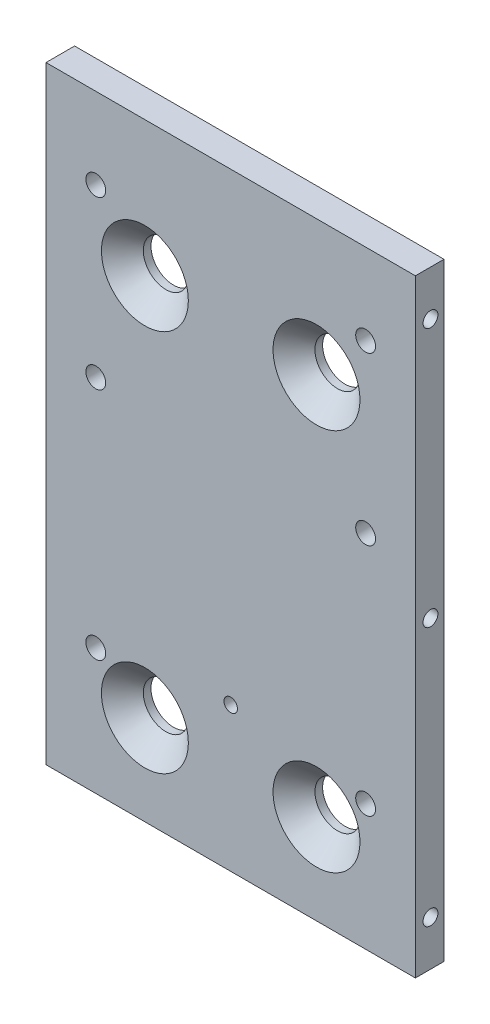
ISO-10303-21;
HEADER;
FILE_DESCRIPTION(('STEP AP214'),'2;1');
FILE_NAME('part.step','',(''),(''),'','','');
FILE_SCHEMA(('AUTOMOTIVE_DESIGN { 1 0 10303 214 1 1 1 1 }'));
ENDSEC;
DATA;
#1=APPLICATION_CONTEXT('core data for automotive mechanical design processes');
#2=APPLICATION_PROTOCOL_DEFINITION('international standard','automotive_design',2000,#1);
#3=PRODUCT_CONTEXT('',#1,'mechanical');
#4=PRODUCT('Part','Part','',(#3));
#5=PRODUCT_RELATED_PRODUCT_CATEGORY('part','',(#4));
#6=PRODUCT_DEFINITION_FORMATION('','',#4);
#7=PRODUCT_DEFINITION_CONTEXT('part definition',#1,'design');
#8=PRODUCT_DEFINITION('design','',#6,#7);
#9=PRODUCT_DEFINITION_SHAPE('','',#8);
#10=(LENGTH_UNIT() NAMED_UNIT(*) SI_UNIT(.MILLI.,.METRE.));
#11=(NAMED_UNIT(*) PLANE_ANGLE_UNIT() SI_UNIT($,.RADIAN.));
#12=(NAMED_UNIT(*) SI_UNIT($,.STERADIAN.) SOLID_ANGLE_UNIT());
#13=UNCERTAINTY_MEASURE_WITH_UNIT(LENGTH_MEASURE(1.E-05),#10,'distance_accuracy_value','');
#14=(GEOMETRIC_REPRESENTATION_CONTEXT(3) GLOBAL_UNCERTAINTY_ASSIGNED_CONTEXT((#13)) GLOBAL_UNIT_ASSIGNED_CONTEXT((#10,
#11,#12)) REPRESENTATION_CONTEXT('',''));
#15=CARTESIAN_POINT('',(0.,0.,0.));
#16=DIRECTION('',(0.,0.,1.));
#17=DIRECTION('',(1.,0.,0.));
#18=AXIS2_PLACEMENT_3D('',#15,#16,#17);
#19=CARTESIAN_POINT('',(0.,0.,6.35));
#20=DIRECTION('',(0.,0.,-1.));
#21=DIRECTION('',(-1.,0.,0.));
#22=AXIS2_PLACEMENT_3D('',#19,#20,#21);
#23=PLANE('',#22);
#24=CARTESIAN_POINT('',(29.95,-39.5,6.34999999999999));
#25=DIRECTION('',(0.,0.,-1.));
#26=DIRECTION('',(-1.,0.,0.));
#27=AXIS2_PLACEMENT_3D('',#24,#25,#26);
#28=CIRCLE('',#27,2.20000000000001);
#29=CARTESIAN_POINT('',(27.75,-39.5,6.34999999999999));
#30=VERTEX_POINT('',#29);
#31=EDGE_CURVE('E224',#30,#30,#28,.T.);
#32=ORIENTED_EDGE('',*,*,#31,.T.);
#33=EDGE_LOOP('',(#32));
#34=FACE_BOUND('',#33,.T.);
#35=CARTESIAN_POINT('',(29.95,12.5,6.34999999999999));
#36=DIRECTION('',(0.,0.,-1.));
#37=DIRECTION('',(-1.,0.,0.));
#38=AXIS2_PLACEMENT_3D('',#35,#36,#37);
#39=CIRCLE('',#38,2.20000000000001);
#40=CARTESIAN_POINT('',(27.75,12.5,6.34999999999999));
#41=VERTEX_POINT('',#40);
#42=EDGE_CURVE('E212',#41,#41,#39,.T.);
#43=ORIENTED_EDGE('',*,*,#42,.T.);
#44=EDGE_LOOP('',(#43));
#45=FACE_BOUND('',#44,.T.);
#46=CARTESIAN_POINT('',(29.95,49.5,6.34999999999999));
#47=DIRECTION('',(0.,0.,-1.));
#48=DIRECTION('',(-1.,0.,0.));
#49=AXIS2_PLACEMENT_3D('',#46,#47,#48);
#50=CIRCLE('',#49,2.20000000000001);
#51=CARTESIAN_POINT('',(27.75,49.5,6.34999999999999));
#52=VERTEX_POINT('',#51);
#53=EDGE_CURVE('E200',#52,#52,#50,.T.);
#54=ORIENTED_EDGE('',*,*,#53,.T.);
#55=EDGE_LOOP('',(#54));
#56=FACE_BOUND('',#55,.T.);
#57=CARTESIAN_POINT('',(-29.95,49.5,6.34999999999999));
#58=DIRECTION('',(0.,0.,-1.));
#59=DIRECTION('',(-1.,0.,0.));
#60=AXIS2_PLACEMENT_3D('',#57,#58,#59);
#61=CIRCLE('',#60,2.20000000000001);
#62=CARTESIAN_POINT('',(-32.15,49.5,6.34999999999999));
#63=VERTEX_POINT('',#62);
#64=EDGE_CURVE('E188',#63,#63,#61,.T.);
#65=ORIENTED_EDGE('',*,*,#64,.T.);
#66=EDGE_LOOP('',(#65));
#67=FACE_BOUND('',#66,.T.);
#68=CARTESIAN_POINT('',(-29.95,12.5,6.34999999999999));
#69=DIRECTION('',(0.,0.,-1.));
#70=DIRECTION('',(-1.,0.,0.));
#71=AXIS2_PLACEMENT_3D('',#68,#69,#70);
#72=CIRCLE('',#71,2.20000000000001);
#73=CARTESIAN_POINT('',(-32.15,12.5,6.34999999999999));
#74=VERTEX_POINT('',#73);
#75=EDGE_CURVE('E176',#74,#74,#72,.T.);
#76=ORIENTED_EDGE('',*,*,#75,.T.);
#77=EDGE_LOOP('',(#76));
#78=FACE_BOUND('',#77,.T.);
#79=CARTESIAN_POINT('',(-29.95,-39.5,6.34999999999999));
#80=DIRECTION('',(0.,0.,-1.));
#81=DIRECTION('',(-1.,0.,0.));
#82=AXIS2_PLACEMENT_3D('',#79,#80,#81);
#83=CIRCLE('',#82,2.20000000000001);
#84=CARTESIAN_POINT('',(-32.15,-39.5,6.34999999999999));
#85=VERTEX_POINT('',#84);
#86=EDGE_CURVE('E162',#85,#85,#83,.T.);
#87=ORIENTED_EDGE('',*,*,#86,.T.);
#88=EDGE_LOOP('',(#87));
#89=FACE_BOUND('',#88,.T.);
#90=CARTESIAN_POINT('',(0.,-35.5,6.35));
#91=DIRECTION('',(0.,0.,-1.));
#92=DIRECTION('',(-1.,0.,0.));
#93=AXIS2_PLACEMENT_3D('',#90,#91,#92);
#94=CIRCLE('',#93,1.5);
#95=CARTESIAN_POINT('',(-1.5,-35.5,6.35));
#96=VERTEX_POINT('',#95);
#97=EDGE_CURVE('E158',#96,#96,#94,.T.);
#98=ORIENTED_EDGE('',*,*,#97,.T.);
#99=EDGE_LOOP('',(#98));
#100=FACE_BOUND('',#99,.T.);
#101=CARTESIAN_POINT('',(-19.05,37.5,6.35));
#102=DIRECTION('',(0.,0.,1.));
#103=DIRECTION('',(1.,0.,0.));
#104=AXIS2_PLACEMENT_3D('',#101,#102,#103);
#105=CIRCLE('',#104,9.65);
#106=CARTESIAN_POINT('',(-9.4,37.5,6.35));
#107=VERTEX_POINT('',#106);
#108=EDGE_CURVE('E155',#107,#107,#105,.T.);
#109=ORIENTED_EDGE('',*,*,#108,.F.);
#110=EDGE_LOOP('',(#109));
#111=FACE_BOUND('',#110,.T.);
#112=CARTESIAN_POINT('',(19.05,37.5,6.35));
#113=DIRECTION('',(0.,0.,1.));
#114=DIRECTION('',(1.,0.,0.));
#115=AXIS2_PLACEMENT_3D('',#112,#113,#114);
#116=CIRCLE('',#115,9.65);
#117=CARTESIAN_POINT('',(28.7,37.5,6.35));
#118=VERTEX_POINT('',#117);
#119=EDGE_CURVE('E146',#118,#118,#116,.T.);
#120=ORIENTED_EDGE('',*,*,#119,.F.);
#121=EDGE_LOOP('',(#120));
#122=FACE_BOUND('',#121,.T.);
#123=CARTESIAN_POINT('',(-19.05,-47.5,6.35));
#124=DIRECTION('',(0.,0.,1.));
#125=DIRECTION('',(1.,0.,0.));
#126=AXIS2_PLACEMENT_3D('',#123,#124,#125);
#127=CIRCLE('',#126,9.65);
#128=CARTESIAN_POINT('',(-9.4,-47.5,6.35));
#129=VERTEX_POINT('',#128);
#130=EDGE_CURVE('E137',#129,#129,#127,.T.);
#131=ORIENTED_EDGE('',*,*,#130,.F.);
#132=EDGE_LOOP('',(#131));
#133=FACE_BOUND('',#132,.T.);
#134=DIRECTION('',(0.,-1.,0.));
#135=VECTOR('',#134,1.);
#136=CARTESIAN_POINT('',(-41.,67.5,6.35));
#137=LINE('',#136,#135);
#138=CARTESIAN_POINT('',(-41.,67.5,6.35));
#139=VERTEX_POINT('',#138);
#140=CARTESIAN_POINT('',(-41.,-67.5,6.35));
#141=VERTEX_POINT('',#140);
#142=EDGE_CURVE('E96',#139,#141,#137,.T.);
#143=ORIENTED_EDGE('',*,*,#142,.T.);
#144=DIRECTION('',(1.,0.,0.));
#145=VECTOR('',#144,1.);
#146=CARTESIAN_POINT('',(41.,-67.5,6.35));
#147=LINE('',#146,#145);
#148=CARTESIAN_POINT('',(41.,-67.5,6.35));
#149=VERTEX_POINT('',#148);
#150=EDGE_CURVE('E91',#141,#149,#147,.T.);
#151=ORIENTED_EDGE('',*,*,#150,.T.);
#152=DIRECTION('',(0.,1.,0.));
#153=VECTOR('',#152,1.);
#154=CARTESIAN_POINT('',(41.,67.5,6.35));
#155=LINE('',#154,#153);
#156=CARTESIAN_POINT('',(41.,67.5,6.35));
#157=VERTEX_POINT('',#156);
#158=EDGE_CURVE('E94',#149,#157,#155,.T.);
#159=ORIENTED_EDGE('',*,*,#158,.T.);
#160=DIRECTION('',(-1.,0.,0.));
#161=VECTOR('',#160,1.);
#162=CARTESIAN_POINT('',(41.,67.5,6.35));
#163=LINE('',#162,#161);
#164=EDGE_CURVE('E61',#157,#139,#163,.T.);
#165=ORIENTED_EDGE('',*,*,#164,.T.);
#166=EDGE_LOOP('',(#143,#151,#159,#165));
#167=FACE_BOUND('',#166,.T.);
#168=CARTESIAN_POINT('',(19.05,-47.5,6.35));
#169=DIRECTION('',(0.,0.,1.));
#170=DIRECTION('',(1.,0.,0.));
#171=AXIS2_PLACEMENT_3D('',#168,#169,#170);
#172=CIRCLE('',#171,9.65);
#173=CARTESIAN_POINT('',(28.7,-47.5,6.35));
#174=VERTEX_POINT('',#173);
#175=EDGE_CURVE('E128',#174,#174,#172,.T.);
#176=ORIENTED_EDGE('',*,*,#175,.F.);
#177=EDGE_LOOP('',(#176));
#178=FACE_BOUND('',#177,.T.);
#179=ADVANCED_FACE('F44',(#34,#45,#56,#67,#78,#89,#100,#111,#122,#133,#167,#178),#23,.F.);
#180=CARTESIAN_POINT('',(0.,0.,0.));
#181=DIRECTION('',(0.,0.,-1.));
#182=DIRECTION('',(-1.,0.,0.));
#183=AXIS2_PLACEMENT_3D('',#180,#181,#182);
#184=PLANE('',#183);
#185=CARTESIAN_POINT('',(29.95,-39.5,0.));
#186=DIRECTION('',(0.,0.,-1.));
#187=DIRECTION('',(-1.,0.,0.));
#188=AXIS2_PLACEMENT_3D('',#185,#186,#187);
#189=CIRCLE('',#188,3.75000000000001);
#190=CARTESIAN_POINT('',(26.2,-39.5,0.));
#191=VERTEX_POINT('',#190);
#192=EDGE_CURVE('E233',#191,#191,#189,.T.);
#193=ORIENTED_EDGE('',*,*,#192,.F.);
#194=EDGE_LOOP('',(#193));
#195=FACE_BOUND('',#194,.T.);
#196=CARTESIAN_POINT('',(29.95,12.5,0.));
#197=DIRECTION('',(0.,0.,-1.));
#198=DIRECTION('',(-1.,0.,0.));
#199=AXIS2_PLACEMENT_3D('',#196,#197,#198);
#200=CIRCLE('',#199,3.75000000000001);
#201=CARTESIAN_POINT('',(26.2,12.5,0.));
#202=VERTEX_POINT('',#201);
#203=EDGE_CURVE('E221',#202,#202,#200,.T.);
#204=ORIENTED_EDGE('',*,*,#203,.F.);
#205=EDGE_LOOP('',(#204));
#206=FACE_BOUND('',#205,.T.);
#207=CARTESIAN_POINT('',(29.95,49.5,0.));
#208=DIRECTION('',(0.,0.,-1.));
#209=DIRECTION('',(-1.,0.,0.));
#210=AXIS2_PLACEMENT_3D('',#207,#208,#209);
#211=CIRCLE('',#210,3.75000000000001);
#212=CARTESIAN_POINT('',(26.2,49.5,0.));
#213=VERTEX_POINT('',#212);
#214=EDGE_CURVE('E209',#213,#213,#211,.T.);
#215=ORIENTED_EDGE('',*,*,#214,.F.);
#216=EDGE_LOOP('',(#215));
#217=FACE_BOUND('',#216,.T.);
#218=CARTESIAN_POINT('',(-29.95,49.5,0.));
#219=DIRECTION('',(0.,0.,-1.));
#220=DIRECTION('',(-1.,0.,0.));
#221=AXIS2_PLACEMENT_3D('',#218,#219,#220);
#222=CIRCLE('',#221,3.75000000000001);
#223=CARTESIAN_POINT('',(-33.7,49.5,0.));
#224=VERTEX_POINT('',#223);
#225=EDGE_CURVE('E197',#224,#224,#222,.T.);
#226=ORIENTED_EDGE('',*,*,#225,.F.);
#227=EDGE_LOOP('',(#226));
#228=FACE_BOUND('',#227,.T.);
#229=CARTESIAN_POINT('',(-29.95,12.5,0.));
#230=DIRECTION('',(0.,0.,-1.));
#231=DIRECTION('',(-1.,0.,0.));
#232=AXIS2_PLACEMENT_3D('',#229,#230,#231);
#233=CIRCLE('',#232,3.75000000000001);
#234=CARTESIAN_POINT('',(-33.7,12.5,0.));
#235=VERTEX_POINT('',#234);
#236=EDGE_CURVE('E185',#235,#235,#233,.T.);
#237=ORIENTED_EDGE('',*,*,#236,.F.);
#238=EDGE_LOOP('',(#237));
#239=FACE_BOUND('',#238,.T.);
#240=CARTESIAN_POINT('',(-29.95,-39.5,0.));
#241=DIRECTION('',(0.,0.,-1.));
#242=DIRECTION('',(-1.,0.,0.));
#243=AXIS2_PLACEMENT_3D('',#240,#241,#242);
#244=CIRCLE('',#243,3.75000000000001);
#245=CARTESIAN_POINT('',(-33.7,-39.5,0.));
#246=VERTEX_POINT('',#245);
#247=EDGE_CURVE('E173',#246,#246,#244,.T.);
#248=ORIENTED_EDGE('',*,*,#247,.F.);
#249=EDGE_LOOP('',(#248));
#250=FACE_BOUND('',#249,.T.);
#251=CARTESIAN_POINT('',(0.,-35.5,0.));
#252=DIRECTION('',(0.,0.,-1.));
#253=DIRECTION('',(-1.,0.,0.));
#254=AXIS2_PLACEMENT_3D('',#251,#252,#253);
#255=CIRCLE('',#254,1.5);
#256=CARTESIAN_POINT('',(-1.5,-35.5,0.));
#257=VERTEX_POINT('',#256);
#258=EDGE_CURVE('E159',#257,#257,#255,.T.);
#259=ORIENTED_EDGE('',*,*,#258,.F.);
#260=EDGE_LOOP('',(#259));
#261=FACE_BOUND('',#260,.T.);
#262=CARTESIAN_POINT('',(-19.05,37.5,0.));
#263=DIRECTION('',(0.,0.,1.));
#264=DIRECTION('',(1.,0.,0.));
#265=AXIS2_PLACEMENT_3D('',#262,#263,#264);
#266=CIRCLE('',#265,5.);
#267=CARTESIAN_POINT('',(-14.05,37.5,0.));
#268=VERTEX_POINT('',#267);
#269=EDGE_CURVE('E149',#268,#268,#266,.T.);
#270=ORIENTED_EDGE('',*,*,#269,.T.);
#271=EDGE_LOOP('',(#270));
#272=FACE_BOUND('',#271,.T.);
#273=CARTESIAN_POINT('',(19.05,37.5,0.));
#274=DIRECTION('',(0.,0.,1.));
#275=DIRECTION('',(1.,0.,0.));
#276=AXIS2_PLACEMENT_3D('',#273,#274,#275);
#277=CIRCLE('',#276,5.);
#278=CARTESIAN_POINT('',(24.05,37.5,0.));
#279=VERTEX_POINT('',#278);
#280=EDGE_CURVE('E140',#279,#279,#277,.T.);
#281=ORIENTED_EDGE('',*,*,#280,.T.);
#282=EDGE_LOOP('',(#281));
#283=FACE_BOUND('',#282,.T.);
#284=CARTESIAN_POINT('',(-19.05,-47.5,0.));
#285=DIRECTION('',(0.,0.,1.));
#286=DIRECTION('',(1.,0.,0.));
#287=AXIS2_PLACEMENT_3D('',#284,#285,#286);
#288=CIRCLE('',#287,5.);
#289=CARTESIAN_POINT('',(-14.05,-47.5,0.));
#290=VERTEX_POINT('',#289);
#291=EDGE_CURVE('E131',#290,#290,#288,.T.);
#292=ORIENTED_EDGE('',*,*,#291,.T.);
#293=EDGE_LOOP('',(#292));
#294=FACE_BOUND('',#293,.T.);
#295=DIRECTION('',(0.,-1.,0.));
#296=VECTOR('',#295,1.);
#297=CARTESIAN_POINT('',(-41.,67.5,0.));
#298=LINE('',#297,#296);
#299=CARTESIAN_POINT('',(-41.,67.5,0.));
#300=VERTEX_POINT('',#299);
#301=CARTESIAN_POINT('',(-41.,-67.5,0.));
#302=VERTEX_POINT('',#301);
#303=EDGE_CURVE('E108',#300,#302,#298,.T.);
#304=ORIENTED_EDGE('',*,*,#303,.F.);
#305=DIRECTION('',(-1.,0.,0.));
#306=VECTOR('',#305,1.);
#307=CARTESIAN_POINT('',(41.,67.5,0.));
#308=LINE('',#307,#306);
#309=CARTESIAN_POINT('',(41.,67.5,0.));
#310=VERTEX_POINT('',#309);
#311=EDGE_CURVE('E84',#310,#300,#308,.T.);
#312=ORIENTED_EDGE('',*,*,#311,.F.);
#313=DIRECTION('',(0.,1.,0.));
#314=VECTOR('',#313,1.);
#315=CARTESIAN_POINT('',(41.,67.5,0.));
#316=LINE('',#315,#314);
#317=CARTESIAN_POINT('',(41.,-67.5,0.));
#318=VERTEX_POINT('',#317);
#319=EDGE_CURVE('E78',#318,#310,#316,.T.);
#320=ORIENTED_EDGE('',*,*,#319,.F.);
#321=DIRECTION('',(1.,0.,0.));
#322=VECTOR('',#321,1.);
#323=CARTESIAN_POINT('',(41.,-67.5,0.));
#324=LINE('',#323,#322);
#325=EDGE_CURVE('E100',#302,#318,#324,.T.);
#326=ORIENTED_EDGE('',*,*,#325,.F.);
#327=EDGE_LOOP('',(#304,#312,#320,#326));
#328=FACE_BOUND('',#327,.T.);
#329=CARTESIAN_POINT('',(19.05,-47.5,0.));
#330=DIRECTION('',(0.,0.,1.));
#331=DIRECTION('',(1.,0.,0.));
#332=AXIS2_PLACEMENT_3D('',#329,#330,#331);
#333=CIRCLE('',#332,5.);
#334=CARTESIAN_POINT('',(24.05,-47.5,0.));
#335=VERTEX_POINT('',#334);
#336=EDGE_CURVE('E111',#335,#335,#333,.T.);
#337=ORIENTED_EDGE('',*,*,#336,.T.);
#338=EDGE_LOOP('',(#337));
#339=FACE_BOUND('',#338,.T.);
#340=ADVANCED_FACE('F119',(#195,#206,#217,#228,#239,#250,#261,#272,#283,#294,#328,#339),#184,.T.);
#341=CARTESIAN_POINT('',(-41.,67.5,6.35));
#342=DIRECTION('',(1.,0.,0.));
#343=DIRECTION('',(0.,1.,0.));
#344=AXIS2_PLACEMENT_3D('',#341,#342,#343);
#345=PLANE('',#344);
#346=CARTESIAN_POINT('',(-41.,0.,3.));
#347=DIRECTION('',(1.,0.,0.));
#348=DIRECTION('',(0.,1.,0.));
#349=AXIS2_PLACEMENT_3D('',#346,#347,#348);
#350=CIRCLE('',#349,1.65);
#351=CARTESIAN_POINT('',(-41.,1.64999999999999,3.));
#352=VERTEX_POINT('',#351);
#353=EDGE_CURVE('E267',#352,#352,#350,.T.);
#354=ORIENTED_EDGE('',*,*,#353,.T.);
#355=EDGE_LOOP('',(#354));
#356=FACE_BOUND('',#355,.T.);
#357=CARTESIAN_POINT('',(-41.,-57.5,3.));
#358=DIRECTION('',(1.,0.,0.));
#359=DIRECTION('',(0.,1.,0.));
#360=AXIS2_PLACEMENT_3D('',#357,#358,#359);
#361=CIRCLE('',#360,1.65);
#362=CARTESIAN_POINT('',(-41.,-55.85,3.));
#363=VERTEX_POINT('',#362);
#364=EDGE_CURVE('E261',#363,#363,#361,.T.);
#365=ORIENTED_EDGE('',*,*,#364,.T.);
#366=EDGE_LOOP('',(#365));
#367=FACE_BOUND('',#366,.T.);
#368=CARTESIAN_POINT('',(-41.,57.5,3.));
#369=DIRECTION('',(1.,0.,0.));
#370=DIRECTION('',(0.,1.,0.));
#371=AXIS2_PLACEMENT_3D('',#368,#369,#370);
#372=CIRCLE('',#371,1.65);
#373=CARTESIAN_POINT('',(-41.,59.15,3.));
#374=VERTEX_POINT('',#373);
#375=EDGE_CURVE('E255',#374,#374,#372,.T.);
#376=ORIENTED_EDGE('',*,*,#375,.T.);
#377=EDGE_LOOP('',(#376));
#378=FACE_BOUND('',#377,.T.);
#379=ORIENTED_EDGE('',*,*,#303,.T.);
#380=DIRECTION('',(0.,0.,-1.));
#381=VECTOR('',#380,1.);
#382=CARTESIAN_POINT('',(-41.,-67.5,6.35));
#383=LINE('',#382,#381);
#384=EDGE_CURVE('E13',#141,#302,#383,.T.);
#385=ORIENTED_EDGE('',*,*,#384,.F.);
#386=ORIENTED_EDGE('',*,*,#142,.F.);
#387=DIRECTION('',(0.,0.,-1.));
#388=VECTOR('',#387,1.);
#389=CARTESIAN_POINT('',(-41.,67.5,6.35));
#390=LINE('',#389,#388);
#391=EDGE_CURVE('E104',#139,#300,#390,.T.);
#392=ORIENTED_EDGE('',*,*,#391,.T.);
#393=EDGE_LOOP('',(#379,#385,#386,#392));
#394=FACE_BOUND('',#393,.T.);
#395=ADVANCED_FACE('F46',(#356,#367,#378,#394),#345,.F.);
#396=CARTESIAN_POINT('',(41.,-67.5,6.35));
#397=DIRECTION('',(0.,1.,0.));
#398=DIRECTION('',(-1.,0.,0.));
#399=AXIS2_PLACEMENT_3D('',#396,#397,#398);
#400=PLANE('',#399);
#401=ORIENTED_EDGE('',*,*,#325,.T.);
#402=DIRECTION('',(0.,0.,-1.));
#403=VECTOR('',#402,1.);
#404=CARTESIAN_POINT('',(41.,-67.5,6.35));
#405=LINE('',#404,#403);
#406=EDGE_CURVE('E53',#149,#318,#405,.T.);
#407=ORIENTED_EDGE('',*,*,#406,.F.);
#408=ORIENTED_EDGE('',*,*,#150,.F.);
#409=ORIENTED_EDGE('',*,*,#384,.T.);
#410=EDGE_LOOP('',(#401,#407,#408,#409));
#411=FACE_BOUND('',#410,.T.);
#412=ADVANCED_FACE('F99',(#411),#400,.F.);
#413=CARTESIAN_POINT('',(41.,67.5,6.35));
#414=DIRECTION('',(-1.,0.,0.));
#415=DIRECTION('',(0.,-1.,0.));
#416=AXIS2_PLACEMENT_3D('',#413,#414,#415);
#417=PLANE('',#416);
#418=CARTESIAN_POINT('',(41.,0.,3.));
#419=DIRECTION('',(1.,0.,0.));
#420=DIRECTION('',(0.,1.,0.));
#421=AXIS2_PLACEMENT_3D('',#418,#419,#420);
#422=CIRCLE('',#421,1.65);
#423=CARTESIAN_POINT('',(41.,1.64999999999999,3.));
#424=VERTEX_POINT('',#423);
#425=EDGE_CURVE('E250',#424,#424,#422,.T.);
#426=ORIENTED_EDGE('',*,*,#425,.F.);
#427=EDGE_LOOP('',(#426));
#428=FACE_BOUND('',#427,.T.);
#429=CARTESIAN_POINT('',(41.,-57.5,3.));
#430=DIRECTION('',(1.,0.,0.));
#431=DIRECTION('',(0.,1.,0.));
#432=AXIS2_PLACEMENT_3D('',#429,#430,#431);
#433=CIRCLE('',#432,1.65);
#434=CARTESIAN_POINT('',(41.,-55.85,3.));
#435=VERTEX_POINT('',#434);
#436=EDGE_CURVE('E243',#435,#435,#433,.T.);
#437=ORIENTED_EDGE('',*,*,#436,.F.);
#438=EDGE_LOOP('',(#437));
#439=FACE_BOUND('',#438,.T.);
#440=CARTESIAN_POINT('',(41.,57.5,3.));
#441=DIRECTION('',(1.,0.,0.));
#442=DIRECTION('',(0.,1.,0.));
#443=AXIS2_PLACEMENT_3D('',#440,#441,#442);
#444=CIRCLE('',#443,1.65);
#445=CARTESIAN_POINT('',(41.,59.15,3.));
#446=VERTEX_POINT('',#445);
#447=EDGE_CURVE('E237',#446,#446,#444,.T.);
#448=ORIENTED_EDGE('',*,*,#447,.F.);
#449=EDGE_LOOP('',(#448));
#450=FACE_BOUND('',#449,.T.);
#451=ORIENTED_EDGE('',*,*,#319,.T.);
#452=DIRECTION('',(0.,0.,-1.));
#453=VECTOR('',#452,1.);
#454=CARTESIAN_POINT('',(41.,67.5,6.35));
#455=LINE('',#454,#453);
#456=EDGE_CURVE('E101',#157,#310,#455,.T.);
#457=ORIENTED_EDGE('',*,*,#456,.F.);
#458=ORIENTED_EDGE('',*,*,#158,.F.);
#459=ORIENTED_EDGE('',*,*,#406,.T.);
#460=EDGE_LOOP('',(#451,#457,#458,#459));
#461=FACE_BOUND('',#460,.T.);
#462=ADVANCED_FACE('F102',(#428,#439,#450,#461),#417,.F.);
#463=CARTESIAN_POINT('',(41.,67.5,6.35));
#464=DIRECTION('',(0.,-1.,0.));
#465=DIRECTION('',(1.,0.,0.));
#466=AXIS2_PLACEMENT_3D('',#463,#464,#465);
#467=PLANE('',#466);
#468=ORIENTED_EDGE('',*,*,#311,.T.);
#469=ORIENTED_EDGE('',*,*,#391,.F.);
#470=ORIENTED_EDGE('',*,*,#164,.F.);
#471=ORIENTED_EDGE('',*,*,#456,.T.);
#472=EDGE_LOOP('',(#468,#469,#470,#471));
#473=FACE_BOUND('',#472,.T.);
#474=ADVANCED_FACE('F116',(#473),#467,.F.);
#475=CARTESIAN_POINT('',(19.05,-47.5,6.35));
#476=DIRECTION('',(0.,0.,1.));
#477=DIRECTION('',(1.,0.,0.));
#478=AXIS2_PLACEMENT_3D('',#475,#476,#477);
#479=CYLINDRICAL_SURFACE('',#478,5.);
#480=ORIENTED_EDGE('',*,*,#336,.F.);
#481=EDGE_LOOP('',(#480));
#482=FACE_BOUND('',#481,.T.);
#483=CARTESIAN_POINT('',(19.05,-47.5,1.7));
#484=DIRECTION('',(0.,0.,1.));
#485=DIRECTION('',(1.,0.,0.));
#486=AXIS2_PLACEMENT_3D('',#483,#484,#485);
#487=CIRCLE('',#486,5.);
#488=CARTESIAN_POINT('',(24.05,-47.5,1.7));
#489=VERTEX_POINT('',#488);
#490=EDGE_CURVE('E125',#489,#489,#487,.T.);
#491=ORIENTED_EDGE('',*,*,#490,.T.);
#492=EDGE_LOOP('',(#491));
#493=FACE_BOUND('',#492,.T.);
#494=ADVANCED_FACE('F294',(#482,#493),#479,.F.);
#495=CARTESIAN_POINT('',(19.05,-47.5,6.35));
#496=DIRECTION('',(0.,0.,1.));
#497=DIRECTION('',(1.,0.,0.));
#498=AXIS2_PLACEMENT_3D('',#495,#496,#497);
#499=CONICAL_SURFACE('',#498,9.65,0.785398163397449);
#500=ORIENTED_EDGE('',*,*,#490,.F.);
#501=EDGE_LOOP('',(#500));
#502=FACE_BOUND('',#501,.T.);
#503=ORIENTED_EDGE('',*,*,#175,.T.);
#504=EDGE_LOOP('',(#503));
#505=FACE_BOUND('',#504,.T.);
#506=ADVANCED_FACE('F449',(#502,#505),#499,.F.);
#507=CARTESIAN_POINT('',(-19.05,-47.5,6.35));
#508=DIRECTION('',(0.,0.,1.));
#509=DIRECTION('',(1.,0.,0.));
#510=AXIS2_PLACEMENT_3D('',#507,#508,#509);
#511=CYLINDRICAL_SURFACE('',#510,5.);
#512=ORIENTED_EDGE('',*,*,#291,.F.);
#513=EDGE_LOOP('',(#512));
#514=FACE_BOUND('',#513,.T.);
#515=CARTESIAN_POINT('',(-19.05,-47.5,1.7));
#516=DIRECTION('',(0.,0.,1.));
#517=DIRECTION('',(1.,0.,0.));
#518=AXIS2_PLACEMENT_3D('',#515,#516,#517);
#519=CIRCLE('',#518,5.);
#520=CARTESIAN_POINT('',(-14.05,-47.5,1.7));
#521=VERTEX_POINT('',#520);
#522=EDGE_CURVE('E134',#521,#521,#519,.T.);
#523=ORIENTED_EDGE('',*,*,#522,.T.);
#524=EDGE_LOOP('',(#523));
#525=FACE_BOUND('',#524,.T.);
#526=ADVANCED_FACE('F446',(#514,#525),#511,.F.);
#527=CARTESIAN_POINT('',(-19.05,-47.5,6.35));
#528=DIRECTION('',(0.,0.,1.));
#529=DIRECTION('',(1.,0.,0.));
#530=AXIS2_PLACEMENT_3D('',#527,#528,#529);
#531=CONICAL_SURFACE('',#530,9.65,0.785398163397449);
#532=ORIENTED_EDGE('',*,*,#522,.F.);
#533=EDGE_LOOP('',(#532));
#534=FACE_BOUND('',#533,.T.);
#535=ORIENTED_EDGE('',*,*,#130,.T.);
#536=EDGE_LOOP('',(#535));
#537=FACE_BOUND('',#536,.T.);
#538=ADVANCED_FACE('F442',(#534,#537),#531,.F.);
#539=CARTESIAN_POINT('',(19.05,37.5,6.35));
#540=DIRECTION('',(0.,0.,1.));
#541=DIRECTION('',(1.,0.,0.));
#542=AXIS2_PLACEMENT_3D('',#539,#540,#541);
#543=CYLINDRICAL_SURFACE('',#542,5.);
#544=ORIENTED_EDGE('',*,*,#280,.F.);
#545=EDGE_LOOP('',(#544));
#546=FACE_BOUND('',#545,.T.);
#547=CARTESIAN_POINT('',(19.05,37.5,1.7));
#548=DIRECTION('',(0.,0.,1.));
#549=DIRECTION('',(1.,0.,0.));
#550=AXIS2_PLACEMENT_3D('',#547,#548,#549);
#551=CIRCLE('',#550,5.);
#552=CARTESIAN_POINT('',(24.05,37.5,1.7));
#553=VERTEX_POINT('',#552);
#554=EDGE_CURVE('E143',#553,#553,#551,.T.);
#555=ORIENTED_EDGE('',*,*,#554,.T.);
#556=EDGE_LOOP('',(#555));
#557=FACE_BOUND('',#556,.T.);
#558=ADVANCED_FACE('F438',(#546,#557),#543,.F.);
#559=CARTESIAN_POINT('',(19.05,37.5,6.35));
#560=DIRECTION('',(0.,0.,1.));
#561=DIRECTION('',(1.,0.,0.));
#562=AXIS2_PLACEMENT_3D('',#559,#560,#561);
#563=CONICAL_SURFACE('',#562,9.65,0.785398163397449);
#564=ORIENTED_EDGE('',*,*,#554,.F.);
#565=EDGE_LOOP('',(#564));
#566=FACE_BOUND('',#565,.T.);
#567=ORIENTED_EDGE('',*,*,#119,.T.);
#568=EDGE_LOOP('',(#567));
#569=FACE_BOUND('',#568,.T.);
#570=ADVANCED_FACE('F434',(#566,#569),#563,.F.);
#571=CARTESIAN_POINT('',(-19.05,37.5,6.35));
#572=DIRECTION('',(0.,0.,1.));
#573=DIRECTION('',(1.,0.,0.));
#574=AXIS2_PLACEMENT_3D('',#571,#572,#573);
#575=CYLINDRICAL_SURFACE('',#574,5.);
#576=ORIENTED_EDGE('',*,*,#269,.F.);
#577=EDGE_LOOP('',(#576));
#578=FACE_BOUND('',#577,.T.);
#579=CARTESIAN_POINT('',(-19.05,37.5,1.7));
#580=DIRECTION('',(0.,0.,1.));
#581=DIRECTION('',(1.,0.,0.));
#582=AXIS2_PLACEMENT_3D('',#579,#580,#581);
#583=CIRCLE('',#582,5.);
#584=CARTESIAN_POINT('',(-14.05,37.5,1.7));
#585=VERTEX_POINT('',#584);
#586=EDGE_CURVE('E152',#585,#585,#583,.T.);
#587=ORIENTED_EDGE('',*,*,#586,.T.);
#588=EDGE_LOOP('',(#587));
#589=FACE_BOUND('',#588,.T.);
#590=ADVANCED_FACE('F430',(#578,#589),#575,.F.);
#591=CARTESIAN_POINT('',(-19.05,37.5,6.35));
#592=DIRECTION('',(0.,0.,1.));
#593=DIRECTION('',(1.,0.,0.));
#594=AXIS2_PLACEMENT_3D('',#591,#592,#593);
#595=CONICAL_SURFACE('',#594,9.65,0.785398163397449);
#596=ORIENTED_EDGE('',*,*,#586,.F.);
#597=EDGE_LOOP('',(#596));
#598=FACE_BOUND('',#597,.T.);
#599=ORIENTED_EDGE('',*,*,#108,.T.);
#600=EDGE_LOOP('',(#599));
#601=FACE_BOUND('',#600,.T.);
#602=ADVANCED_FACE('F426',(#598,#601),#595,.F.);
#603=CARTESIAN_POINT('',(0.,-35.5,6.35));
#604=DIRECTION('',(0.,0.,-1.));
#605=DIRECTION('',(-1.,0.,0.));
#606=AXIS2_PLACEMENT_3D('',#603,#604,#605);
#607=CYLINDRICAL_SURFACE('',#606,1.5);
#608=ORIENTED_EDGE('',*,*,#97,.F.);
#609=EDGE_LOOP('',(#608));
#610=FACE_BOUND('',#609,.T.);
#611=ORIENTED_EDGE('',*,*,#258,.T.);
#612=EDGE_LOOP('',(#611));
#613=FACE_BOUND('',#612,.T.);
#614=ADVANCED_FACE('F422',(#610,#613),#607,.F.);
#615=CARTESIAN_POINT('',(-29.95,-39.5,0.));
#616=DIRECTION('',(0.,0.,-1.));
#617=DIRECTION('',(-1.,0.,0.));
#618=AXIS2_PLACEMENT_3D('',#615,#616,#617);
#619=CYLINDRICAL_SURFACE('',#618,2.20000000000001);
#620=ORIENTED_EDGE('',*,*,#86,.F.);
#621=EDGE_LOOP('',(#620));
#622=FACE_BOUND('',#621,.T.);
#623=CARTESIAN_POINT('',(-29.95,-39.5,3.));
#624=DIRECTION('',(0.,0.,-1.));
#625=DIRECTION('',(-1.,0.,0.));
#626=AXIS2_PLACEMENT_3D('',#623,#624,#625);
#627=CIRCLE('',#626,2.20000000000001);
#628=CARTESIAN_POINT('',(-32.15,-39.5,3.));
#629=VERTEX_POINT('',#628);
#630=EDGE_CURVE('E167',#629,#629,#627,.T.);
#631=ORIENTED_EDGE('',*,*,#630,.T.);
#632=EDGE_LOOP('',(#631));
#633=FACE_BOUND('',#632,.T.);
#634=ADVANCED_FACE('F418',(#622,#633),#619,.F.);
#635=CARTESIAN_POINT('',(-27.75,-39.5,3.));
#636=DIRECTION('',(0.,0.,1.));
#637=DIRECTION('',(1.,0.,0.));
#638=AXIS2_PLACEMENT_3D('',#635,#636,#637);
#639=PLANE('',#638);
#640=ORIENTED_EDGE('',*,*,#630,.F.);
#641=EDGE_LOOP('',(#640));
#642=FACE_BOUND('',#641,.T.);
#643=CARTESIAN_POINT('',(-29.95,-39.5,3.));
#644=DIRECTION('',(0.,0.,-1.));
#645=DIRECTION('',(-1.,0.,0.));
#646=AXIS2_PLACEMENT_3D('',#643,#644,#645);
#647=CIRCLE('',#646,3.75000000000001);
#648=CARTESIAN_POINT('',(-33.7,-39.5,3.));
#649=VERTEX_POINT('',#648);
#650=EDGE_CURVE('E170',#649,#649,#647,.T.);
#651=ORIENTED_EDGE('',*,*,#650,.T.);
#652=EDGE_LOOP('',(#651));
#653=FACE_BOUND('',#652,.T.);
#654=ADVANCED_FACE('F414',(#642,#653),#639,.F.);
#655=CARTESIAN_POINT('',(-29.95,-39.5,0.));
#656=DIRECTION('',(0.,0.,-1.));
#657=DIRECTION('',(-1.,0.,0.));
#658=AXIS2_PLACEMENT_3D('',#655,#656,#657);
#659=CYLINDRICAL_SURFACE('',#658,3.75000000000001);
#660=ORIENTED_EDGE('',*,*,#650,.F.);
#661=EDGE_LOOP('',(#660));
#662=FACE_BOUND('',#661,.T.);
#663=ORIENTED_EDGE('',*,*,#247,.T.);
#664=EDGE_LOOP('',(#663));
#665=FACE_BOUND('',#664,.T.);
#666=ADVANCED_FACE('F410',(#662,#665),#659,.F.);
#667=CARTESIAN_POINT('',(-29.95,12.5,0.));
#668=DIRECTION('',(0.,0.,-1.));
#669=DIRECTION('',(-1.,0.,0.));
#670=AXIS2_PLACEMENT_3D('',#667,#668,#669);
#671=CYLINDRICAL_SURFACE('',#670,2.20000000000001);
#672=ORIENTED_EDGE('',*,*,#75,.F.);
#673=EDGE_LOOP('',(#672));
#674=FACE_BOUND('',#673,.T.);
#675=CARTESIAN_POINT('',(-29.95,12.5,3.));
#676=DIRECTION('',(0.,0.,-1.));
#677=DIRECTION('',(-1.,0.,0.));
#678=AXIS2_PLACEMENT_3D('',#675,#676,#677);
#679=CIRCLE('',#678,2.20000000000001);
#680=CARTESIAN_POINT('',(-32.15,12.5,3.));
#681=VERTEX_POINT('',#680);
#682=EDGE_CURVE('E179',#681,#681,#679,.T.);
#683=ORIENTED_EDGE('',*,*,#682,.T.);
#684=EDGE_LOOP('',(#683));
#685=FACE_BOUND('',#684,.T.);
#686=ADVANCED_FACE('F406',(#674,#685),#671,.F.);
#687=CARTESIAN_POINT('',(-27.75,12.5,3.));
#688=DIRECTION('',(0.,0.,1.));
#689=DIRECTION('',(1.,0.,0.));
#690=AXIS2_PLACEMENT_3D('',#687,#688,#689);
#691=PLANE('',#690);
#692=ORIENTED_EDGE('',*,*,#682,.F.);
#693=EDGE_LOOP('',(#692));
#694=FACE_BOUND('',#693,.T.);
#695=CARTESIAN_POINT('',(-29.95,12.5,3.));
#696=DIRECTION('',(0.,0.,-1.));
#697=DIRECTION('',(-1.,0.,0.));
#698=AXIS2_PLACEMENT_3D('',#695,#696,#697);
#699=CIRCLE('',#698,3.75000000000001);
#700=CARTESIAN_POINT('',(-33.7,12.5,3.));
#701=VERTEX_POINT('',#700);
#702=EDGE_CURVE('E182',#701,#701,#699,.T.);
#703=ORIENTED_EDGE('',*,*,#702,.T.);
#704=EDGE_LOOP('',(#703));
#705=FACE_BOUND('',#704,.T.);
#706=ADVANCED_FACE('F402',(#694,#705),#691,.F.);
#707=CARTESIAN_POINT('',(-29.95,12.5,0.));
#708=DIRECTION('',(0.,0.,-1.));
#709=DIRECTION('',(-1.,0.,0.));
#710=AXIS2_PLACEMENT_3D('',#707,#708,#709);
#711=CYLINDRICAL_SURFACE('',#710,3.75000000000001);
#712=ORIENTED_EDGE('',*,*,#702,.F.);
#713=EDGE_LOOP('',(#712));
#714=FACE_BOUND('',#713,.T.);
#715=ORIENTED_EDGE('',*,*,#236,.T.);
#716=EDGE_LOOP('',(#715));
#717=FACE_BOUND('',#716,.T.);
#718=ADVANCED_FACE('F398',(#714,#717),#711,.F.);
#719=CARTESIAN_POINT('',(-29.95,49.5,0.));
#720=DIRECTION('',(0.,0.,-1.));
#721=DIRECTION('',(-1.,0.,0.));
#722=AXIS2_PLACEMENT_3D('',#719,#720,#721);
#723=CYLINDRICAL_SURFACE('',#722,2.20000000000001);
#724=ORIENTED_EDGE('',*,*,#64,.F.);
#725=EDGE_LOOP('',(#724));
#726=FACE_BOUND('',#725,.T.);
#727=CARTESIAN_POINT('',(-29.95,49.5,3.));
#728=DIRECTION('',(0.,0.,-1.));
#729=DIRECTION('',(-1.,0.,0.));
#730=AXIS2_PLACEMENT_3D('',#727,#728,#729);
#731=CIRCLE('',#730,2.20000000000001);
#732=CARTESIAN_POINT('',(-32.15,49.5,3.));
#733=VERTEX_POINT('',#732);
#734=EDGE_CURVE('E191',#733,#733,#731,.T.);
#735=ORIENTED_EDGE('',*,*,#734,.T.);
#736=EDGE_LOOP('',(#735));
#737=FACE_BOUND('',#736,.T.);
#738=ADVANCED_FACE('F394',(#726,#737),#723,.F.);
#739=CARTESIAN_POINT('',(-27.75,49.5,3.));
#740=DIRECTION('',(0.,0.,1.));
#741=DIRECTION('',(1.,0.,0.));
#742=AXIS2_PLACEMENT_3D('',#739,#740,#741);
#743=PLANE('',#742);
#744=ORIENTED_EDGE('',*,*,#734,.F.);
#745=EDGE_LOOP('',(#744));
#746=FACE_BOUND('',#745,.T.);
#747=CARTESIAN_POINT('',(-29.95,49.5,3.));
#748=DIRECTION('',(0.,0.,-1.));
#749=DIRECTION('',(-1.,0.,0.));
#750=AXIS2_PLACEMENT_3D('',#747,#748,#749);
#751=CIRCLE('',#750,3.75000000000001);
#752=CARTESIAN_POINT('',(-33.7,49.5,3.));
#753=VERTEX_POINT('',#752);
#754=EDGE_CURVE('E194',#753,#753,#751,.T.);
#755=ORIENTED_EDGE('',*,*,#754,.T.);
#756=EDGE_LOOP('',(#755));
#757=FACE_BOUND('',#756,.T.);
#758=ADVANCED_FACE('F390',(#746,#757),#743,.F.);
#759=CARTESIAN_POINT('',(-29.95,49.5,0.));
#760=DIRECTION('',(0.,0.,-1.));
#761=DIRECTION('',(-1.,0.,0.));
#762=AXIS2_PLACEMENT_3D('',#759,#760,#761);
#763=CYLINDRICAL_SURFACE('',#762,3.75000000000001);
#764=ORIENTED_EDGE('',*,*,#754,.F.);
#765=EDGE_LOOP('',(#764));
#766=FACE_BOUND('',#765,.T.);
#767=ORIENTED_EDGE('',*,*,#225,.T.);
#768=EDGE_LOOP('',(#767));
#769=FACE_BOUND('',#768,.T.);
#770=ADVANCED_FACE('F386',(#766,#769),#763,.F.);
#771=CARTESIAN_POINT('',(29.95,49.5,0.));
#772=DIRECTION('',(0.,0.,-1.));
#773=DIRECTION('',(-1.,0.,0.));
#774=AXIS2_PLACEMENT_3D('',#771,#772,#773);
#775=CYLINDRICAL_SURFACE('',#774,2.20000000000001);
#776=ORIENTED_EDGE('',*,*,#53,.F.);
#777=EDGE_LOOP('',(#776));
#778=FACE_BOUND('',#777,.T.);
#779=CARTESIAN_POINT('',(29.95,49.5,3.));
#780=DIRECTION('',(0.,0.,-1.));
#781=DIRECTION('',(-1.,0.,0.));
#782=AXIS2_PLACEMENT_3D('',#779,#780,#781);
#783=CIRCLE('',#782,2.20000000000002);
#784=CARTESIAN_POINT('',(27.75,49.5,3.));
#785=VERTEX_POINT('',#784);
#786=EDGE_CURVE('E203',#785,#785,#783,.T.);
#787=ORIENTED_EDGE('',*,*,#786,.T.);
#788=EDGE_LOOP('',(#787));
#789=FACE_BOUND('',#788,.T.);
#790=ADVANCED_FACE('F382',(#778,#789),#775,.F.);
#791=CARTESIAN_POINT('',(32.15,49.5,3.));
#792=DIRECTION('',(0.,0.,1.));
#793=DIRECTION('',(1.,0.,0.));
#794=AXIS2_PLACEMENT_3D('',#791,#792,#793);
#795=PLANE('',#794);
#796=ORIENTED_EDGE('',*,*,#786,.F.);
#797=EDGE_LOOP('',(#796));
#798=FACE_BOUND('',#797,.T.);
#799=CARTESIAN_POINT('',(29.95,49.5,3.));
#800=DIRECTION('',(0.,0.,-1.));
#801=DIRECTION('',(-1.,0.,0.));
#802=AXIS2_PLACEMENT_3D('',#799,#800,#801);
#803=CIRCLE('',#802,3.75000000000001);
#804=CARTESIAN_POINT('',(26.2,49.5,3.));
#805=VERTEX_POINT('',#804);
#806=EDGE_CURVE('E206',#805,#805,#803,.T.);
#807=ORIENTED_EDGE('',*,*,#806,.T.);
#808=EDGE_LOOP('',(#807));
#809=FACE_BOUND('',#808,.T.);
#810=ADVANCED_FACE('F378',(#798,#809),#795,.F.);
#811=CARTESIAN_POINT('',(29.95,49.5,0.));
#812=DIRECTION('',(0.,0.,-1.));
#813=DIRECTION('',(-1.,0.,0.));
#814=AXIS2_PLACEMENT_3D('',#811,#812,#813);
#815=CYLINDRICAL_SURFACE('',#814,3.75000000000001);
#816=ORIENTED_EDGE('',*,*,#806,.F.);
#817=EDGE_LOOP('',(#816));
#818=FACE_BOUND('',#817,.T.);
#819=ORIENTED_EDGE('',*,*,#214,.T.);
#820=EDGE_LOOP('',(#819));
#821=FACE_BOUND('',#820,.T.);
#822=ADVANCED_FACE('F374',(#818,#821),#815,.F.);
#823=CARTESIAN_POINT('',(29.95,12.5,0.));
#824=DIRECTION('',(0.,0.,-1.));
#825=DIRECTION('',(-1.,0.,0.));
#826=AXIS2_PLACEMENT_3D('',#823,#824,#825);
#827=CYLINDRICAL_SURFACE('',#826,2.20000000000001);
#828=ORIENTED_EDGE('',*,*,#42,.F.);
#829=EDGE_LOOP('',(#828));
#830=FACE_BOUND('',#829,.T.);
#831=CARTESIAN_POINT('',(29.95,12.5,3.));
#832=DIRECTION('',(0.,0.,-1.));
#833=DIRECTION('',(-1.,0.,0.));
#834=AXIS2_PLACEMENT_3D('',#831,#832,#833);
#835=CIRCLE('',#834,2.20000000000002);
#836=CARTESIAN_POINT('',(27.75,12.5,3.));
#837=VERTEX_POINT('',#836);
#838=EDGE_CURVE('E215',#837,#837,#835,.T.);
#839=ORIENTED_EDGE('',*,*,#838,.T.);
#840=EDGE_LOOP('',(#839));
#841=FACE_BOUND('',#840,.T.);
#842=ADVANCED_FACE('F370',(#830,#841),#827,.F.);
#843=CARTESIAN_POINT('',(32.15,12.5,3.));
#844=DIRECTION('',(0.,0.,1.));
#845=DIRECTION('',(1.,0.,0.));
#846=AXIS2_PLACEMENT_3D('',#843,#844,#845);
#847=PLANE('',#846);
#848=ORIENTED_EDGE('',*,*,#838,.F.);
#849=EDGE_LOOP('',(#848));
#850=FACE_BOUND('',#849,.T.);
#851=CARTESIAN_POINT('',(29.95,12.5,3.));
#852=DIRECTION('',(0.,0.,-1.));
#853=DIRECTION('',(-1.,0.,0.));
#854=AXIS2_PLACEMENT_3D('',#851,#852,#853);
#855=CIRCLE('',#854,3.75000000000001);
#856=CARTESIAN_POINT('',(26.2,12.5,3.));
#857=VERTEX_POINT('',#856);
#858=EDGE_CURVE('E218',#857,#857,#855,.T.);
#859=ORIENTED_EDGE('',*,*,#858,.T.);
#860=EDGE_LOOP('',(#859));
#861=FACE_BOUND('',#860,.T.);
#862=ADVANCED_FACE('F366',(#850,#861),#847,.F.);
#863=CARTESIAN_POINT('',(29.95,12.5,0.));
#864=DIRECTION('',(0.,0.,-1.));
#865=DIRECTION('',(-1.,0.,0.));
#866=AXIS2_PLACEMENT_3D('',#863,#864,#865);
#867=CYLINDRICAL_SURFACE('',#866,3.75000000000001);
#868=ORIENTED_EDGE('',*,*,#858,.F.);
#869=EDGE_LOOP('',(#868));
#870=FACE_BOUND('',#869,.T.);
#871=ORIENTED_EDGE('',*,*,#203,.T.);
#872=EDGE_LOOP('',(#871));
#873=FACE_BOUND('',#872,.T.);
#874=ADVANCED_FACE('F362',(#870,#873),#867,.F.);
#875=CARTESIAN_POINT('',(29.95,-39.5,0.));
#876=DIRECTION('',(0.,0.,-1.));
#877=DIRECTION('',(-1.,0.,0.));
#878=AXIS2_PLACEMENT_3D('',#875,#876,#877);
#879=CYLINDRICAL_SURFACE('',#878,2.20000000000001);
#880=ORIENTED_EDGE('',*,*,#31,.F.);
#881=EDGE_LOOP('',(#880));
#882=FACE_BOUND('',#881,.T.);
#883=CARTESIAN_POINT('',(29.95,-39.5,3.));
#884=DIRECTION('',(0.,0.,-1.));
#885=DIRECTION('',(-1.,0.,0.));
#886=AXIS2_PLACEMENT_3D('',#883,#884,#885);
#887=CIRCLE('',#886,2.20000000000002);
#888=CARTESIAN_POINT('',(27.75,-39.5,3.));
#889=VERTEX_POINT('',#888);
#890=EDGE_CURVE('E227',#889,#889,#887,.T.);
#891=ORIENTED_EDGE('',*,*,#890,.T.);
#892=EDGE_LOOP('',(#891));
#893=FACE_BOUND('',#892,.T.);
#894=ADVANCED_FACE('F358',(#882,#893),#879,.F.);
#895=CARTESIAN_POINT('',(32.15,-39.5,3.));
#896=DIRECTION('',(0.,0.,1.));
#897=DIRECTION('',(1.,0.,0.));
#898=AXIS2_PLACEMENT_3D('',#895,#896,#897);
#899=PLANE('',#898);
#900=ORIENTED_EDGE('',*,*,#890,.F.);
#901=EDGE_LOOP('',(#900));
#902=FACE_BOUND('',#901,.T.);
#903=CARTESIAN_POINT('',(29.95,-39.5,3.));
#904=DIRECTION('',(0.,0.,-1.));
#905=DIRECTION('',(-1.,0.,0.));
#906=AXIS2_PLACEMENT_3D('',#903,#904,#905);
#907=CIRCLE('',#906,3.75000000000001);
#908=CARTESIAN_POINT('',(26.2,-39.5,3.));
#909=VERTEX_POINT('',#908);
#910=EDGE_CURVE('E230',#909,#909,#907,.T.);
#911=ORIENTED_EDGE('',*,*,#910,.T.);
#912=EDGE_LOOP('',(#911));
#913=FACE_BOUND('',#912,.T.);
#914=ADVANCED_FACE('F354',(#902,#913),#899,.F.);
#915=CARTESIAN_POINT('',(29.95,-39.5,0.));
#916=DIRECTION('',(0.,0.,-1.));
#917=DIRECTION('',(-1.,0.,0.));
#918=AXIS2_PLACEMENT_3D('',#915,#916,#917);
#919=CYLINDRICAL_SURFACE('',#918,3.75000000000001);
#920=ORIENTED_EDGE('',*,*,#910,.F.);
#921=EDGE_LOOP('',(#920));
#922=FACE_BOUND('',#921,.T.);
#923=ORIENTED_EDGE('',*,*,#192,.T.);
#924=EDGE_LOOP('',(#923));
#925=FACE_BOUND('',#924,.T.);
#926=ADVANCED_FACE('F350',(#922,#925),#919,.F.);
#927=CARTESIAN_POINT('',(26.,57.5,3.));
#928=DIRECTION('',(1.,0.,0.));
#929=DIRECTION('',(0.,1.,0.));
#930=AXIS2_PLACEMENT_3D('',#927,#928,#929);
#931=CYLINDRICAL_SURFACE('',#930,1.65);
#932=CARTESIAN_POINT('',(26.,57.5,3.));
#933=DIRECTION('',(1.,0.,0.));
#934=DIRECTION('',(0.,1.,0.));
#935=AXIS2_PLACEMENT_3D('',#932,#933,#934);
#936=CIRCLE('',#935,1.65);
#937=CARTESIAN_POINT('',(26.,59.15,3.));
#938=VERTEX_POINT('',#937);
#939=EDGE_CURVE('E236',#938,#938,#936,.T.);
#940=ORIENTED_EDGE('',*,*,#939,.F.);
#941=EDGE_LOOP('',(#940));
#942=FACE_BOUND('',#941,.T.);
#943=ORIENTED_EDGE('',*,*,#447,.T.);
#944=EDGE_LOOP('',(#943));
#945=FACE_BOUND('',#944,.T.);
#946=ADVANCED_FACE('F346',(#942,#945),#931,.F.);
#947=CARTESIAN_POINT('',(26.,57.5,3.));
#948=DIRECTION('',(1.,0.,0.));
#949=DIRECTION('',(0.,1.,0.));
#950=AXIS2_PLACEMENT_3D('',#947,#948,#949);
#951=PLANE('',#950);
#952=ORIENTED_EDGE('',*,*,#939,.T.);
#953=EDGE_LOOP('',(#952));
#954=FACE_BOUND('',#953,.T.);
#955=ADVANCED_FACE('F342',(#954),#951,.T.);
#956=CARTESIAN_POINT('',(26.,-57.5,3.));
#957=DIRECTION('',(1.,0.,0.));
#958=DIRECTION('',(0.,1.,0.));
#959=AXIS2_PLACEMENT_3D('',#956,#957,#958);
#960=CYLINDRICAL_SURFACE('',#959,1.65);
#961=CARTESIAN_POINT('',(26.,-57.5,3.));
#962=DIRECTION('',(1.,0.,0.));
#963=DIRECTION('',(0.,1.,0.));
#964=AXIS2_PLACEMENT_3D('',#961,#962,#963);
#965=CIRCLE('',#964,1.65);
#966=CARTESIAN_POINT('',(26.,-55.85,3.));
#967=VERTEX_POINT('',#966);
#968=EDGE_CURVE('E246',#967,#967,#965,.T.);
#969=ORIENTED_EDGE('',*,*,#968,.F.);
#970=EDGE_LOOP('',(#969));
#971=FACE_BOUND('',#970,.T.);
#972=ORIENTED_EDGE('',*,*,#436,.T.);
#973=EDGE_LOOP('',(#972));
#974=FACE_BOUND('',#973,.T.);
#975=ADVANCED_FACE('F338',(#971,#974),#960,.F.);
#976=CARTESIAN_POINT('',(26.,-57.5,3.));
#977=DIRECTION('',(1.,0.,0.));
#978=DIRECTION('',(0.,1.,0.));
#979=AXIS2_PLACEMENT_3D('',#976,#977,#978);
#980=PLANE('',#979);
#981=ORIENTED_EDGE('',*,*,#968,.T.);
#982=EDGE_LOOP('',(#981));
#983=FACE_BOUND('',#982,.T.);
#984=ADVANCED_FACE('F334',(#983),#980,.T.);
#985=CARTESIAN_POINT('',(26.,0.,3.));
#986=DIRECTION('',(1.,0.,0.));
#987=DIRECTION('',(0.,1.,0.));
#988=AXIS2_PLACEMENT_3D('',#985,#986,#987);
#989=CYLINDRICAL_SURFACE('',#988,1.65);
#990=CARTESIAN_POINT('',(26.,0.,3.));
#991=DIRECTION('',(1.,0.,0.));
#992=DIRECTION('',(0.,1.,0.));
#993=AXIS2_PLACEMENT_3D('',#990,#991,#992);
#994=CIRCLE('',#993,1.65);
#995=CARTESIAN_POINT('',(26.,1.64999999999999,3.));
#996=VERTEX_POINT('',#995);
#997=EDGE_CURVE('E240',#996,#996,#994,.T.);
#998=ORIENTED_EDGE('',*,*,#997,.F.);
#999=EDGE_LOOP('',(#998));
#1000=FACE_BOUND('',#999,.T.);
#1001=ORIENTED_EDGE('',*,*,#425,.T.);
#1002=EDGE_LOOP('',(#1001));
#1003=FACE_BOUND('',#1002,.T.);
#1004=ADVANCED_FACE('F327',(#1000,#1003),#989,.F.);
#1005=CARTESIAN_POINT('',(26.,0.,3.));
#1006=DIRECTION('',(1.,0.,0.));
#1007=DIRECTION('',(0.,1.,0.));
#1008=AXIS2_PLACEMENT_3D('',#1005,#1006,#1007);
#1009=PLANE('',#1008);
#1010=ORIENTED_EDGE('',*,*,#997,.T.);
#1011=EDGE_LOOP('',(#1010));
#1012=FACE_BOUND('',#1011,.T.);
#1013=ADVANCED_FACE('F317',(#1012),#1009,.T.);
#1014=CARTESIAN_POINT('',(-26.,57.5,3.));
#1015=DIRECTION('',(-1.,0.,0.));
#1016=DIRECTION('',(0.,-1.,0.));
#1017=AXIS2_PLACEMENT_3D('',#1014,#1015,#1016);
#1018=CYLINDRICAL_SURFACE('',#1017,1.65);
#1019=CARTESIAN_POINT('',(-26.,57.5,3.));
#1020=DIRECTION('',(1.,0.,0.));
#1021=DIRECTION('',(0.,1.,0.));
#1022=AXIS2_PLACEMENT_3D('',#1019,#1020,#1021);
#1023=CIRCLE('',#1022,1.65);
#1024=CARTESIAN_POINT('',(-26.,59.15,3.));
#1025=VERTEX_POINT('',#1024);
#1026=EDGE_CURVE('E247',#1025,#1025,#1023,.T.);
#1027=ORIENTED_EDGE('',*,*,#1026,.T.);
#1028=EDGE_LOOP('',(#1027));
#1029=FACE_BOUND('',#1028,.T.);
#1030=ORIENTED_EDGE('',*,*,#375,.F.);
#1031=EDGE_LOOP('',(#1030));
#1032=FACE_BOUND('',#1031,.T.);
#1033=ADVANCED_FACE('F314',(#1029,#1032),#1018,.F.);
#1034=CARTESIAN_POINT('',(-26.,57.5,3.));
#1035=DIRECTION('',(-1.,0.,0.));
#1036=DIRECTION('',(0.,1.,0.));
#1037=AXIS2_PLACEMENT_3D('',#1034,#1035,#1036);
#1038=PLANE('',#1037);
#1039=ORIENTED_EDGE('',*,*,#1026,.F.);
#1040=EDGE_LOOP('',(#1039));
#1041=FACE_BOUND('',#1040,.T.);
#1042=ADVANCED_FACE('F316',(#1041),#1038,.T.);
#1043=CARTESIAN_POINT('',(-26.,-57.5,3.));
#1044=DIRECTION('',(-1.,0.,0.));
#1045=DIRECTION('',(0.,-1.,0.));
#1046=AXIS2_PLACEMENT_3D('',#1043,#1044,#1045);
#1047=CYLINDRICAL_SURFACE('',#1046,1.65);
#1048=CARTESIAN_POINT('',(-26.,-57.5,3.));
#1049=DIRECTION('',(1.,0.,0.));
#1050=DIRECTION('',(0.,1.,0.));
#1051=AXIS2_PLACEMENT_3D('',#1048,#1049,#1050);
#1052=CIRCLE('',#1051,1.65);
#1053=CARTESIAN_POINT('',(-26.,-55.85,3.));
#1054=VERTEX_POINT('',#1053);
#1055=EDGE_CURVE('E264',#1054,#1054,#1052,.T.);
#1056=ORIENTED_EDGE('',*,*,#1055,.T.);
#1057=EDGE_LOOP('',(#1056));
#1058=FACE_BOUND('',#1057,.T.);
#1059=ORIENTED_EDGE('',*,*,#364,.F.);
#1060=EDGE_LOOP('',(#1059));
#1061=FACE_BOUND('',#1060,.T.);
#1062=ADVANCED_FACE('F324',(#1058,#1061),#1047,.F.);
#1063=CARTESIAN_POINT('',(-26.,-57.5,3.));
#1064=DIRECTION('',(-1.,0.,0.));
#1065=DIRECTION('',(0.,1.,0.));
#1066=AXIS2_PLACEMENT_3D('',#1063,#1064,#1065);
#1067=PLANE('',#1066);
#1068=ORIENTED_EDGE('',*,*,#1055,.F.);
#1069=EDGE_LOOP('',(#1068));
#1070=FACE_BOUND('',#1069,.T.);
#1071=ADVANCED_FACE('F282',(#1070),#1067,.T.);
#1072=CARTESIAN_POINT('',(-26.,0.,3.));
#1073=DIRECTION('',(-1.,0.,0.));
#1074=DIRECTION('',(0.,-1.,0.));
#1075=AXIS2_PLACEMENT_3D('',#1072,#1073,#1074);
#1076=CYLINDRICAL_SURFACE('',#1075,1.65);
#1077=CARTESIAN_POINT('',(-26.,0.,3.));
#1078=DIRECTION('',(1.,0.,0.));
#1079=DIRECTION('',(0.,1.,0.));
#1080=AXIS2_PLACEMENT_3D('',#1077,#1078,#1079);
#1081=CIRCLE('',#1080,1.65);
#1082=CARTESIAN_POINT('',(-26.,1.64999999999999,3.));
#1083=VERTEX_POINT('',#1082);
#1084=EDGE_CURVE('E258',#1083,#1083,#1081,.T.);
#1085=ORIENTED_EDGE('',*,*,#1084,.T.);
#1086=EDGE_LOOP('',(#1085));
#1087=FACE_BOUND('',#1086,.T.);
#1088=ORIENTED_EDGE('',*,*,#353,.F.);
#1089=EDGE_LOOP('',(#1088));
#1090=FACE_BOUND('',#1089,.T.);
#1091=ADVANCED_FACE('F273',(#1087,#1090),#1076,.F.);
#1092=CARTESIAN_POINT('',(-26.,0.,3.));
#1093=DIRECTION('',(-1.,0.,0.));
#1094=DIRECTION('',(0.,1.,0.));
#1095=AXIS2_PLACEMENT_3D('',#1092,#1093,#1094);
#1096=PLANE('',#1095);
#1097=ORIENTED_EDGE('',*,*,#1084,.F.);
#1098=EDGE_LOOP('',(#1097));
#1099=FACE_BOUND('',#1098,.T.);
#1100=ADVANCED_FACE('F276',(#1099),#1096,.T.);
#1101=CLOSED_SHELL('',(#179,#340,#395,#412,#462,#474,#494,#506,#526,#538,#558,#570,#590,#602,
#614,#634,#654,#666,#686,#706,#718,#738,#758,#770,#790,#810,#822,#842,#862,#874,#894,#914,#926,
#946,#955,#975,#984,#1004,#1013,#1033,#1042,#1062,#1071,#1091,#1100));
#1102=MANIFOLD_SOLID_BREP('B2',#1101);
#1103=ADVANCED_BREP_SHAPE_REPRESENTATION('',(#18,#1102),#14);
#1104=SHAPE_DEFINITION_REPRESENTATION(#9,#1103);
ENDSEC;
END-ISO-10303-21;
